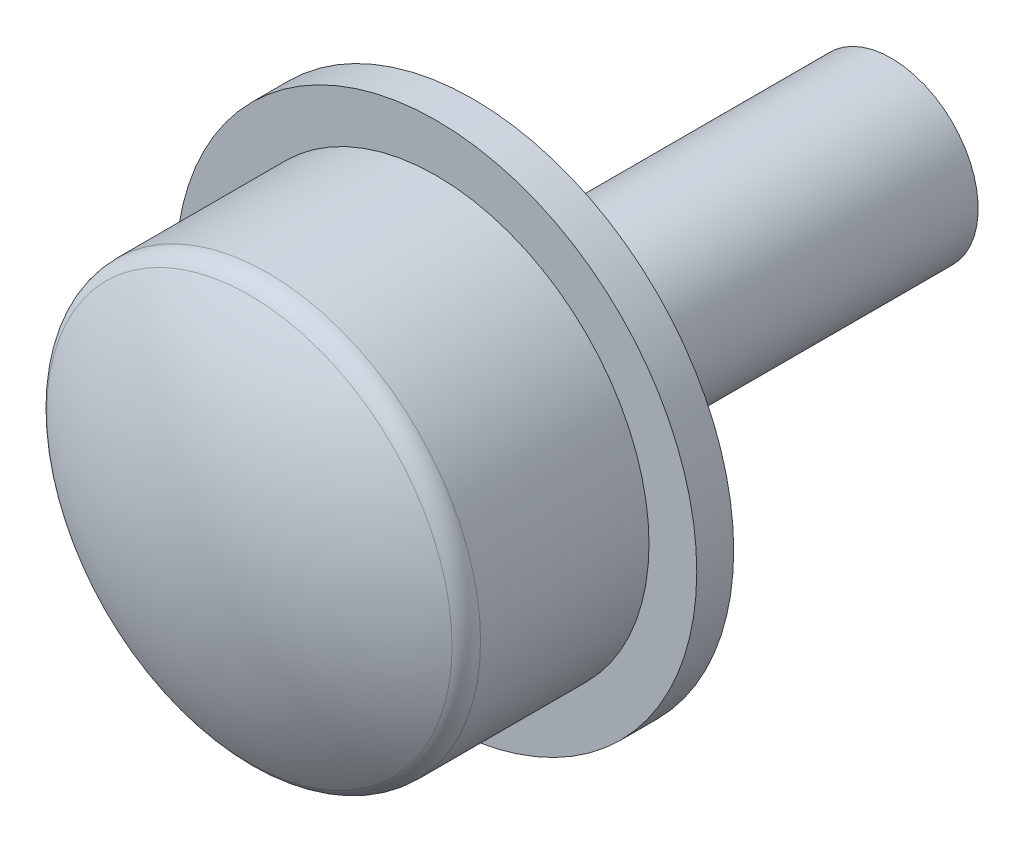
ISO-10303-21;
HEADER;
FILE_DESCRIPTION(('STEP AP214'),'2;1');
FILE_NAME('part.step','',(''),(''),'','','');
FILE_SCHEMA(('AUTOMOTIVE_DESIGN { 1 0 10303 214 1 1 1 1 }'));
ENDSEC;
DATA;
#1=APPLICATION_CONTEXT('core data for automotive mechanical design processes');
#2=APPLICATION_PROTOCOL_DEFINITION('international standard','automotive_design',2000,#1);
#3=PRODUCT_CONTEXT('',#1,'mechanical');
#4=PRODUCT('Part','Part','',(#3));
#5=PRODUCT_RELATED_PRODUCT_CATEGORY('part','',(#4));
#6=PRODUCT_DEFINITION_FORMATION('','',#4);
#7=PRODUCT_DEFINITION_CONTEXT('part definition',#1,'design');
#8=PRODUCT_DEFINITION('design','',#6,#7);
#9=PRODUCT_DEFINITION_SHAPE('','',#8);
#10=(LENGTH_UNIT() NAMED_UNIT(*) SI_UNIT(.MILLI.,.METRE.));
#11=(NAMED_UNIT(*) PLANE_ANGLE_UNIT() SI_UNIT($,.RADIAN.));
#12=(NAMED_UNIT(*) SI_UNIT($,.STERADIAN.) SOLID_ANGLE_UNIT());
#13=UNCERTAINTY_MEASURE_WITH_UNIT(LENGTH_MEASURE(1.E-05),#10,'distance_accuracy_value','');
#14=(GEOMETRIC_REPRESENTATION_CONTEXT(3) GLOBAL_UNCERTAINTY_ASSIGNED_CONTEXT((#13)) GLOBAL_UNIT_ASSIGNED_CONTEXT((#10,
#11,#12)) REPRESENTATION_CONTEXT('',''));
#15=CARTESIAN_POINT('',(0.,0.,0.));
#16=DIRECTION('',(0.,0.,1.));
#17=DIRECTION('',(1.,0.,0.));
#18=AXIS2_PLACEMENT_3D('',#15,#16,#17);
#19=CARTESIAN_POINT('',(0.,0.,5.));
#20=DIRECTION('',(0.,0.,-1.));
#21=DIRECTION('',(-1.,0.,0.));
#22=AXIS2_PLACEMENT_3D('',#19,#20,#21);
#23=CYLINDRICAL_SURFACE('',#22,4.15);
#24=DIRECTION('',(0.,0.,-1.));
#25=VECTOR('',#24,1.);
#26=CARTESIAN_POINT('',(4.02771647462927,1.,6.50200231381359));
#27=LINE('',#26,#25);
#28=CARTESIAN_POINT('',(4.02771647462927,1.,5.));
#29=VERTEX_POINT('',#28);
#30=CARTESIAN_POINT('',(4.02771647462927,1.,0.));
#31=VERTEX_POINT('',#30);
#32=EDGE_CURVE('E203',#29,#31,#27,.T.);
#33=ORIENTED_EDGE('',*,*,#32,.F.);
#34=CARTESIAN_POINT('',(0.,0.,5.));
#35=DIRECTION('',(0.,0.,1.));
#36=DIRECTION('',(1.,0.,0.));
#37=AXIS2_PLACEMENT_3D('',#34,#35,#36);
#38=CIRCLE('',#37,4.15);
#39=CARTESIAN_POINT('',(1.,4.02771647462927,5.));
#40=VERTEX_POINT('',#39);
#41=EDGE_CURVE('E395',#29,#40,#38,.T.);
#42=ORIENTED_EDGE('',*,*,#41,.T.);
#43=DIRECTION('',(0.,0.,-1.));
#44=VECTOR('',#43,1.);
#45=CARTESIAN_POINT('',(1.,4.02771647462927,6.50200231381359));
#46=LINE('',#45,#44);
#47=CARTESIAN_POINT('',(1.,4.02771647462927,0.));
#48=VERTEX_POINT('',#47);
#49=EDGE_CURVE('E232',#40,#48,#46,.T.);
#50=ORIENTED_EDGE('',*,*,#49,.T.);
#51=CARTESIAN_POINT('',(0.,0.,0.));
#52=DIRECTION('',(0.,0.,1.));
#53=DIRECTION('',(1.,0.,0.));
#54=AXIS2_PLACEMENT_3D('',#51,#52,#53);
#55=CIRCLE('',#54,4.15);
#56=EDGE_CURVE('E394',#31,#48,#55,.T.);
#57=ORIENTED_EDGE('',*,*,#56,.F.);
#58=EDGE_LOOP('',(#33,#42,#50,#57));
#59=FACE_BOUND('',#58,.T.);
#60=ADVANCED_FACE('F35',(#59),#23,.F.);
#61=DIRECTION('',(0.,0.,-1.));
#62=VECTOR('',#61,1.);
#63=CARTESIAN_POINT('',(-1.,4.02771647462927,6.50200231381359));
#64=LINE('',#63,#62);
#65=CARTESIAN_POINT('',(-1.,4.02771647462927,5.));
#66=VERTEX_POINT('',#65);
#67=CARTESIAN_POINT('',(-1.,4.02771647462927,0.));
#68=VERTEX_POINT('',#67);
#69=EDGE_CURVE('E229',#66,#68,#64,.T.);
#70=ORIENTED_EDGE('',*,*,#69,.F.);
#71=CARTESIAN_POINT('',(-4.02771647462927,1.,5.));
#72=VERTEX_POINT('',#71);
#73=EDGE_CURVE('E384',#66,#72,#38,.T.);
#74=ORIENTED_EDGE('',*,*,#73,.T.);
#75=DIRECTION('',(0.,0.,-1.));
#76=VECTOR('',#75,1.);
#77=CARTESIAN_POINT('',(-4.02771647462927,1.,6.50200231381359));
#78=LINE('',#77,#76);
#79=CARTESIAN_POINT('',(-4.02771647462927,1.,0.));
#80=VERTEX_POINT('',#79);
#81=EDGE_CURVE('E174',#72,#80,#78,.T.);
#82=ORIENTED_EDGE('',*,*,#81,.T.);
#83=EDGE_CURVE('E161',#68,#80,#55,.T.);
#84=ORIENTED_EDGE('',*,*,#83,.F.);
#85=EDGE_LOOP('',(#70,#74,#82,#84));
#86=FACE_BOUND('',#85,.T.);
#87=ADVANCED_FACE('F344',(#86),#23,.F.);
#88=DIRECTION('',(0.,0.,-1.));
#89=VECTOR('',#88,1.);
#90=CARTESIAN_POINT('',(-4.02771647462927,-1.,6.50200231381359));
#91=LINE('',#90,#89);
#92=CARTESIAN_POINT('',(-4.02771647462927,-1.,5.));
#93=VERTEX_POINT('',#92);
#94=CARTESIAN_POINT('',(-4.02771647462927,-1.,0.));
#95=VERTEX_POINT('',#94);
#96=EDGE_CURVE('E223',#93,#95,#91,.T.);
#97=ORIENTED_EDGE('',*,*,#96,.F.);
#98=CARTESIAN_POINT('',(-1.,-4.02771647462927,5.));
#99=VERTEX_POINT('',#98);
#100=EDGE_CURVE('E377',#93,#99,#38,.T.);
#101=ORIENTED_EDGE('',*,*,#100,.T.);
#102=DIRECTION('',(0.,0.,-1.));
#103=VECTOR('',#102,1.);
#104=CARTESIAN_POINT('',(-1.,-4.02771647462927,6.50200231381359));
#105=LINE('',#104,#103);
#106=CARTESIAN_POINT('',(-1.,-4.02771647462927,0.));
#107=VERTEX_POINT('',#106);
#108=EDGE_CURVE('E218',#99,#107,#105,.T.);
#109=ORIENTED_EDGE('',*,*,#108,.T.);
#110=EDGE_CURVE('E380',#95,#107,#55,.T.);
#111=ORIENTED_EDGE('',*,*,#110,.F.);
#112=EDGE_LOOP('',(#97,#101,#109,#111));
#113=FACE_BOUND('',#112,.T.);
#114=ADVANCED_FACE('F352',(#113),#23,.F.);
#115=CARTESIAN_POINT('',(0.,0.,-3.21655236778393));
#116=DIRECTION('',(0.,0.,1.));
#117=DIRECTION('',(1.,0.,0.));
#118=AXIS2_PLACEMENT_3D('',#115,#116,#117);
#119=DEGENERATE_TOROIDAL_SURFACE('',#118,0.0253740645262453,9.21658729635075,.F.);
#120=CARTESIAN_POINT('',(6.53192942485932,1.,3.18214986142363));
#121=CARTESIAN_POINT('',(6.35206909688982,1.,3.36649956792769));
#122=CARTESIAN_POINT('',(6.16439973885727,1.,3.54322318707306));
#123=CARTESIAN_POINT('',(5.77486056698641,1.,3.88024953473658));
#124=CARTESIAN_POINT('',(5.57299106941987,1.,4.04055262878468));
#125=CARTESIAN_POINT('',(5.1564498999669,1.,4.3435856623148));
#126=CARTESIAN_POINT('',(4.94177754095202,1.,4.48631465733434));
#127=CARTESIAN_POINT('',(4.50118006526702,1.,4.75317503449112));
#128=CARTESIAN_POINT('',(4.27525535908262,1.,4.87730709438356));
#129=CARTESIAN_POINT('',(3.81365350792917,1.,5.1061403855081));
#130=CARTESIAN_POINT('',(3.57797236559759,1.,5.21083355401045));
#131=CARTESIAN_POINT('',(3.09852107819419,1.,5.40001651648054));
#132=CARTESIAN_POINT('',(2.85474750406803,1.,5.48449761815065));
#133=CARTESIAN_POINT('',(2.36131074648482,1.,5.63247153418416));
#134=CARTESIAN_POINT('',(2.1116571668672,1.,5.69599633185864));
#135=CARTESIAN_POINT('',(1.60787948458233,1.,5.80175958941425));
#136=CARTESIAN_POINT('',(1.35375487043481,1.,5.84399559728385));
#137=CARTESIAN_POINT('',(0.788100464502108,1.,5.9134855110936));
#138=CARTESIAN_POINT('',(0.475912414796059,1.,5.9356063771239));
#139=CARTESIAN_POINT('',(0.00746429644385302,1.,5.94417836303991));
#140=CARTESIAN_POINT('',(-0.148665256544842,1.,5.94293825300488));
#141=CARTESIAN_POINT('',(-0.46069089883751,1.,5.93231111796492));
#142=CARTESIAN_POINT('',(-0.616586910585928,1.,5.92292181331315));
#143=CARTESIAN_POINT('',(-0.772162142661165,1.,5.90948110171508));
#144=B_SPLINE_CURVE_WITH_KNOTS('',3,(#120,#121,#122,#123,#124,#125,#126,#127,#128,#129,#130,
#131,#132,#133,#134,#135,#136,#137,#138,#139,#140,#141,#142,#143),.UNSPECIFIED.,.F.,.F.,(4,2,2,
2,2,2,2,2,2,2,2,4),(0.,0.772429127626245,1.5448410568151,2.31729447865604,3.08971974199993,
3.86246467436917,4.63554133449136,5.40743261431704,6.17941277914229,7.11642454678658,
7.58464580752683,8.05299809020406),.UNSPECIFIED.);
#145=CARTESIAN_POINT('',(1.73205080756888,1.,5.77474015832146));
#146=VERTEX_POINT('',#145);
#147=EDGE_CURVE('E241',#29,#146,#144,.T.);
#148=ORIENTED_EDGE('',*,*,#147,.T.);
#149=CARTESIAN_POINT('',(0.,0.,5.77474015832146));
#150=DIRECTION('',(0.,0.,-1.));
#151=DIRECTION('',(-1.,0.,0.));
#152=AXIS2_PLACEMENT_3D('',#149,#150,#151);
#153=CIRCLE('',#152,2.);
#154=CARTESIAN_POINT('',(1.,1.73205080756888,5.77474015832146));
#155=VERTEX_POINT('',#154);
#156=EDGE_CURVE('E250',#146,#155,#153,.F.);
#157=ORIENTED_EDGE('',*,*,#156,.T.);
#158=CARTESIAN_POINT('',(1.,-0.772162142661165,5.90948110171508));
#159=CARTESIAN_POINT('',(1.,-0.66642808665959,5.91860700766712));
#160=CARTESIAN_POINT('',(1.,-0.560532462606554,5.92587235308661));
#161=CARTESIAN_POINT('',(1.,-0.348569071241919,5.93664821484036));
#162=CARTESIAN_POINT('',(1.,-0.242501337286459,5.94015938783224));
#163=CARTESIAN_POINT('',(1.,0.0759440215439665,5.94501728638047));
#164=CARTESIAN_POINT('',(1.,0.288409173270856,5.94067498008673));
#165=CARTESIAN_POINT('',(1.,0.928333905571847,5.90486499386678));
#166=CARTESIAN_POINT('',(1.,1.35479725140542,5.85031084196622));
#167=CARTESIAN_POINT('',(1.,1.9854613887249,5.72415462738974));
#168=CARTESIAN_POINT('',(1.,2.1944093255515,5.67463368904586));
#169=CARTESIAN_POINT('',(1.,2.60829800539381,5.56102832090942));
#170=CARTESIAN_POINT('',(1.,2.81323983582733,5.49694790447495));
#171=CARTESIAN_POINT('',(1.,3.25755474000364,5.34066862731467));
#172=CARTESIAN_POINT('',(1.,3.49586003877173,5.24542409160749));
#173=CARTESIAN_POINT('',(1.,3.96358066825006,5.03530522174408));
#174=CARTESIAN_POINT('',(1.,4.19299807275107,4.92043550093886));
#175=CARTESIAN_POINT('',(1.,4.64122242040377,4.67195717746327));
#176=CARTESIAN_POINT('',(1.,4.86003715547419,4.53836262564036));
#177=CARTESIAN_POINT('',(1.,5.28561449083834,4.25336564489637));
#178=CARTESIAN_POINT('',(1.,5.49238277220873,4.10197171346415));
#179=CARTESIAN_POINT('',(1.,5.84014435631191,3.82422971079596));
#180=CARTESIAN_POINT('',(1.,5.98419611115803,3.70168790239723));
#181=CARTESIAN_POINT('',(1.,6.26418814179404,3.44816743245459));
#182=CARTESIAN_POINT('',(1.,6.40014293939572,3.31720480856869));
#183=CARTESIAN_POINT('',(1.,6.53192942485932,3.18214986142363));
#184=B_SPLINE_CURVE_WITH_KNOTS('',3,(#158,#159,#160,#161,#162,#163,#164,#165,#166,#167,#168,
#169,#170,#171,#172,#173,#174,#175,#176,#177,#178,#179,#180,#181,#182,#183),.UNSPECIFIED.,.F.,
.F.,(4,2,2,2,2,2,2,2,2,2,2,2,4),(0.,0.318366500520787,0.636677305142935,1.27376334427966,
2.55845828462446,3.20226695640181,3.8458983754865,4.61488148711788,5.38368407968487,
6.15191283187279,6.9197763068146,7.48679955136423,8.05277315999369),.UNSPECIFIED.);
#185=EDGE_CURVE('E264',#155,#40,#184,.T.);
#186=ORIENTED_EDGE('',*,*,#185,.T.);
#187=ORIENTED_EDGE('',*,*,#41,.F.);
#188=EDGE_LOOP('',(#148,#157,#186,#187));
#189=FACE_BOUND('',#188,.T.);
#190=ADVANCED_FACE('F363',(#189),#119,.T.);
#191=CARTESIAN_POINT('',(-1.,6.53192942485932,3.18214986142362));
#192=CARTESIAN_POINT('',(-1.,6.35206909688982,3.36649956792769));
#193=CARTESIAN_POINT('',(-1.,6.16439973885727,3.54322318707306));
#194=CARTESIAN_POINT('',(-1.,5.77486056698641,3.88024953473658));
#195=CARTESIAN_POINT('',(-1.,5.57299106941987,4.04055262878468));
#196=CARTESIAN_POINT('',(-1.,5.1564498999669,4.3435856623148));
#197=CARTESIAN_POINT('',(-1.,4.94177754095202,4.48631465733434));
#198=CARTESIAN_POINT('',(-1.,4.50118006526702,4.75317503449111));
#199=CARTESIAN_POINT('',(-1.,4.27525535908262,4.87730709438356));
#200=CARTESIAN_POINT('',(-1.,3.81365350792917,5.1061403855081));
#201=CARTESIAN_POINT('',(-1.,3.57797236559759,5.21083355401045));
#202=CARTESIAN_POINT('',(-1.,3.09852107819419,5.40001651648054));
#203=CARTESIAN_POINT('',(-1.,2.85474750406804,5.48449761815065));
#204=CARTESIAN_POINT('',(-1.,2.36131074648482,5.63247153418416));
#205=CARTESIAN_POINT('',(-1.,2.11165716686721,5.69599633185864));
#206=CARTESIAN_POINT('',(-1.,1.60787948458234,5.80175958941425));
#207=CARTESIAN_POINT('',(-1.,1.35375487043482,5.84399559728385));
#208=CARTESIAN_POINT('',(-1.,0.788100464502113,5.9134855110936));
#209=CARTESIAN_POINT('',(-1.,0.475912414796063,5.9356063771239));
#210=CARTESIAN_POINT('',(-1.,0.00746429644385486,5.94417836303991));
#211=CARTESIAN_POINT('',(-1.,-0.148665256544841,5.94293825300488));
#212=CARTESIAN_POINT('',(-1.,-0.46069089883751,5.93231111796492));
#213=CARTESIAN_POINT('',(-1.,-0.616586910585929,5.92292181331315));
#214=CARTESIAN_POINT('',(-1.,-0.772162142661166,5.90948110171508));
#215=B_SPLINE_CURVE_WITH_KNOTS('',3,(#191,#192,#193,#194,#195,#196,#197,#198,#199,#200,#201,
#202,#203,#204,#205,#206,#207,#208,#209,#210,#211,#212,#213,#214),.UNSPECIFIED.,.F.,.F.,(4,2,2,
2,2,2,2,2,2,2,2,4),(0.,0.772429127626246,1.5448410568151,2.31729447865604,3.08971974199993,
3.86246467436917,4.63554133449136,5.40743261431704,6.17941277914229,7.11642454678658,
7.58464580752683,8.05299809020407),.UNSPECIFIED.);
#216=CARTESIAN_POINT('',(-1.,1.73205080756888,5.77474015832146));
#217=VERTEX_POINT('',#216);
#218=EDGE_CURVE('E272',#66,#217,#215,.T.);
#219=ORIENTED_EDGE('',*,*,#218,.T.);
#220=CARTESIAN_POINT('',(0.,0.,5.77474015832146));
#221=DIRECTION('',(0.,0.,-1.));
#222=DIRECTION('',(-1.,0.,0.));
#223=AXIS2_PLACEMENT_3D('',#220,#221,#222);
#224=CIRCLE('',#223,2.);
#225=CARTESIAN_POINT('',(-1.73205080756888,1.,5.77474015832146));
#226=VERTEX_POINT('',#225);
#227=EDGE_CURVE('E387',#217,#226,#224,.F.);
#228=ORIENTED_EDGE('',*,*,#227,.T.);
#229=CARTESIAN_POINT('',(0.772162142661165,1.,5.90948110171508));
#230=CARTESIAN_POINT('',(0.66642808665959,1.,5.91860700766712));
#231=CARTESIAN_POINT('',(0.560532462606554,1.,5.92587235308661));
#232=CARTESIAN_POINT('',(0.348569071241919,1.,5.93664821484036));
#233=CARTESIAN_POINT('',(0.242501337286459,1.,5.94015938783224));
#234=CARTESIAN_POINT('',(-0.0759440215439665,1.,5.94501728638047));
#235=CARTESIAN_POINT('',(-0.288409173270856,1.,5.94067498008673));
#236=CARTESIAN_POINT('',(-0.928333905571847,1.,5.90486499386678));
#237=CARTESIAN_POINT('',(-1.35479725140542,1.,5.85031084196622));
#238=CARTESIAN_POINT('',(-1.9854613887249,1.,5.72415462738974));
#239=CARTESIAN_POINT('',(-2.1944093255515,1.,5.67463368904586));
#240=CARTESIAN_POINT('',(-2.60829800539381,1.,5.56102832090942));
#241=CARTESIAN_POINT('',(-2.81323983582733,1.,5.49694790447495));
#242=CARTESIAN_POINT('',(-3.25755474000364,1.,5.34066862731467));
#243=CARTESIAN_POINT('',(-3.49586003877173,1.,5.24542409160749));
#244=CARTESIAN_POINT('',(-3.96358066825006,1.,5.03530522174408));
#245=CARTESIAN_POINT('',(-4.19299807275107,1.,4.92043550093886));
#246=CARTESIAN_POINT('',(-4.64122242040377,1.,4.67195717746327));
#247=CARTESIAN_POINT('',(-4.86003715547419,1.,4.53836262564036));
#248=CARTESIAN_POINT('',(-5.28561449083834,1.,4.25336564489637));
#249=CARTESIAN_POINT('',(-5.49238277220873,1.,4.10197171346415));
#250=CARTESIAN_POINT('',(-5.84014435631191,1.,3.82422971079596));
#251=CARTESIAN_POINT('',(-5.98419611115803,1.,3.70168790239723));
#252=CARTESIAN_POINT('',(-6.26418814179404,1.,3.44816743245459));
#253=CARTESIAN_POINT('',(-6.40014293939572,1.,3.31720480856869));
#254=CARTESIAN_POINT('',(-6.53192942485932,1.,3.18214986142363));
#255=B_SPLINE_CURVE_WITH_KNOTS('',3,(#229,#230,#231,#232,#233,#234,#235,#236,#237,#238,#239,
#240,#241,#242,#243,#244,#245,#246,#247,#248,#249,#250,#251,#252,#253,#254),.UNSPECIFIED.,.F.,
.F.,(4,2,2,2,2,2,2,2,2,2,2,2,4),(0.,0.318366500520787,0.636677305142935,1.27376334427966,
2.55845828462446,3.20226695640181,3.8458983754865,4.61488148711788,5.38368407968487,
6.15191283187279,6.9197763068146,7.48679955136423,8.05277315999369),.UNSPECIFIED.);
#256=EDGE_CURVE('E171',#226,#72,#255,.T.);
#257=ORIENTED_EDGE('',*,*,#256,.T.);
#258=ORIENTED_EDGE('',*,*,#73,.F.);
#259=EDGE_LOOP('',(#219,#228,#257,#258));
#260=FACE_BOUND('',#259,.T.);
#261=ADVANCED_FACE('F373',(#260),#119,.T.);
#262=CARTESIAN_POINT('',(-6.53192942485932,-1.,3.18214986142363));
#263=CARTESIAN_POINT('',(-6.35206909688982,-1.,3.36649956792769));
#264=CARTESIAN_POINT('',(-6.16439973885727,-1.,3.54322318707306));
#265=CARTESIAN_POINT('',(-5.77486056698641,-1.,3.88024953473658));
#266=CARTESIAN_POINT('',(-5.57299106941987,-1.,4.04055262878468));
#267=CARTESIAN_POINT('',(-5.1564498999669,-1.,4.3435856623148));
#268=CARTESIAN_POINT('',(-4.94177754095202,-1.,4.48631465733434));
#269=CARTESIAN_POINT('',(-4.50118006526702,-1.,4.75317503449112));
#270=CARTESIAN_POINT('',(-4.27525535908262,-1.,4.87730709438356));
#271=CARTESIAN_POINT('',(-3.81365350792917,-1.,5.10614038550811));
#272=CARTESIAN_POINT('',(-3.57797236559759,-1.,5.21083355401045));
#273=CARTESIAN_POINT('',(-3.09852107819419,-1.,5.40001651648054));
#274=CARTESIAN_POINT('',(-2.85474750406803,-1.,5.48449761815065));
#275=CARTESIAN_POINT('',(-2.36131074648482,-1.,5.63247153418416));
#276=CARTESIAN_POINT('',(-2.1116571668672,-1.,5.69599633185864));
#277=CARTESIAN_POINT('',(-1.60787948458234,-1.,5.80175958941425));
#278=CARTESIAN_POINT('',(-1.35375487043482,-1.,5.84399559728385));
#279=CARTESIAN_POINT('',(-0.788100464502109,-1.,5.9134855110936));
#280=CARTESIAN_POINT('',(-0.475912414796059,-1.,5.9356063771239));
#281=CARTESIAN_POINT('',(-0.00746429644385348,-1.,5.94417836303991));
#282=CARTESIAN_POINT('',(0.148665256544841,-1.,5.94293825300488));
#283=CARTESIAN_POINT('',(0.460690898837509,-1.,5.93231111796492));
#284=CARTESIAN_POINT('',(0.616586910585928,-1.,5.92292181331315));
#285=CARTESIAN_POINT('',(0.772162142661165,-1.,5.90948110171508));
#286=B_SPLINE_CURVE_WITH_KNOTS('',3,(#262,#263,#264,#265,#266,#267,#268,#269,#270,#271,#272,
#273,#274,#275,#276,#277,#278,#279,#280,#281,#282,#283,#284,#285),.UNSPECIFIED.,.F.,.F.,(4,2,2,
2,2,2,2,2,2,2,2,4),(0.,0.772429127626245,1.5448410568151,2.31729447865604,3.08971974199993,
3.86246467436917,4.63554133449136,5.40743261431704,6.17941277914229,7.11642454678658,
7.58464580752683,8.05299809020406),.UNSPECIFIED.);
#287=CARTESIAN_POINT('',(-1.73205080756888,-1.,5.77474015832146));
#288=VERTEX_POINT('',#287);
#289=EDGE_CURVE('E288',#93,#288,#286,.T.);
#290=ORIENTED_EDGE('',*,*,#289,.T.);
#291=CARTESIAN_POINT('',(0.,0.,5.77474015832146));
#292=DIRECTION('',(0.,0.,-1.));
#293=DIRECTION('',(-1.,0.,0.));
#294=AXIS2_PLACEMENT_3D('',#291,#292,#293);
#295=CIRCLE('',#294,2.);
#296=CARTESIAN_POINT('',(-1.,-1.73205080756888,5.77474015832146));
#297=VERTEX_POINT('',#296);
#298=EDGE_CURVE('E386',#288,#297,#295,.F.);
#299=ORIENTED_EDGE('',*,*,#298,.T.);
#300=CARTESIAN_POINT('',(-1.,0.772162142661166,5.90948110171508));
#301=CARTESIAN_POINT('',(-1.,0.666428086659591,5.91860700766712));
#302=CARTESIAN_POINT('',(-1.,0.560532462606555,5.92587235308661));
#303=CARTESIAN_POINT('',(-1.,0.34856907124192,5.93664821484036));
#304=CARTESIAN_POINT('',(-1.,0.24250133728646,5.94015938783224));
#305=CARTESIAN_POINT('',(-1.,-0.0759440215439656,5.94501728638047));
#306=CARTESIAN_POINT('',(-1.,-0.288409173270854,5.94067498008673));
#307=CARTESIAN_POINT('',(-1.,-0.928333905571844,5.90486499386678));
#308=CARTESIAN_POINT('',(-1.,-1.35479725140542,5.85031084196622));
#309=CARTESIAN_POINT('',(-1.,-1.9854613887249,5.72415462738974));
#310=CARTESIAN_POINT('',(-1.,-2.1944093255515,5.67463368904586));
#311=CARTESIAN_POINT('',(-1.,-2.6082980053938,5.56102832090942));
#312=CARTESIAN_POINT('',(-1.,-2.81323983582733,5.49694790447495));
#313=CARTESIAN_POINT('',(-1.,-3.25755474000364,5.34066862731467));
#314=CARTESIAN_POINT('',(-1.,-3.49586003877172,5.24542409160749));
#315=CARTESIAN_POINT('',(-1.,-3.96358066825006,5.03530522174408));
#316=CARTESIAN_POINT('',(-1.,-4.19299807275107,4.92043550093886));
#317=CARTESIAN_POINT('',(-1.,-4.64122242040377,4.67195717746327));
#318=CARTESIAN_POINT('',(-1.,-4.86003715547419,4.53836262564037));
#319=CARTESIAN_POINT('',(-1.,-5.28561449083834,4.25336564489637));
#320=CARTESIAN_POINT('',(-1.,-5.49238277220872,4.10197171346415));
#321=CARTESIAN_POINT('',(-1.,-5.84014435631191,3.82422971079596));
#322=CARTESIAN_POINT('',(-1.,-5.98419611115803,3.70168790239723));
#323=CARTESIAN_POINT('',(-1.,-6.26418814179404,3.44816743245459));
#324=CARTESIAN_POINT('',(-1.,-6.40014293939572,3.31720480856869));
#325=CARTESIAN_POINT('',(-1.,-6.53192942485933,3.18214986142363));
#326=B_SPLINE_CURVE_WITH_KNOTS('',3,(#300,#301,#302,#303,#304,#305,#306,#307,#308,#309,#310,
#311,#312,#313,#314,#315,#316,#317,#318,#319,#320,#321,#322,#323,#324,#325),.UNSPECIFIED.,.F.,
.F.,(4,2,2,2,2,2,2,2,2,2,2,2,4),(0.,0.318366500520788,0.636677305142936,1.27376334427966,
2.55845828462446,3.2022669564018,3.8458983754865,4.61488148711788,5.38368407968487,
6.15191283187279,6.91977630681459,7.48679955136423,8.05277315999369),.UNSPECIFIED.);
#327=EDGE_CURVE('E296',#297,#99,#326,.T.);
#328=ORIENTED_EDGE('',*,*,#327,.T.);
#329=ORIENTED_EDGE('',*,*,#100,.F.);
#330=EDGE_LOOP('',(#290,#299,#328,#329));
#331=FACE_BOUND('',#330,.T.);
#332=ADVANCED_FACE('F364',(#331),#119,.T.);
#333=CARTESIAN_POINT('',(0.,0.,4.72955185991567));
#334=DIRECTION('',(0.,0.,-1.));
#335=DIRECTION('',(-1.,0.,0.));
#336=AXIS2_PLACEMENT_3D('',#333,#334,#335);
#337=TOROIDAL_SURFACE('',#336,4.4,0.5);
#338=CARTESIAN_POINT('',(0.,0.,5.15239184037038));
#339=DIRECTION('',(0.,0.,-1.));
#340=DIRECTION('',(-1.,0.,0.));
#341=AXIS2_PLACEMENT_3D('',#338,#339,#340);
#342=CIRCLE('',#341,4.66684518157363);
#343=CARTESIAN_POINT('',(-4.66684518157363,0.,5.15239184037038));
#344=VERTEX_POINT('',#343);
#345=EDGE_CURVE('E187',#344,#344,#342,.F.);
#346=ORIENTED_EDGE('',*,*,#345,.F.);
#347=EDGE_LOOP('',(#346));
#348=FACE_BOUND('',#347,.T.);
#349=CARTESIAN_POINT('',(0.,0.,4.72955185991567));
#350=DIRECTION('',(0.,0.,-1.));
#351=DIRECTION('',(-1.,0.,0.));
#352=AXIS2_PLACEMENT_3D('',#349,#350,#351);
#353=CIRCLE('',#352,4.9);
#354=CARTESIAN_POINT('',(-4.9,0.,4.72955185991567));
#355=VERTEX_POINT('',#354);
#356=EDGE_CURVE('E39',#355,#355,#353,.T.);
#357=ORIENTED_EDGE('',*,*,#356,.F.);
#358=EDGE_LOOP('',(#357));
#359=FACE_BOUND('',#358,.T.);
#360=ADVANCED_FACE('F37',(#348,#359),#337,.T.);
#361=CARTESIAN_POINT('',(0.,0.,0.85));
#362=DIRECTION('',(0.,0.,1.));
#363=DIRECTION('',(1.,0.,0.));
#364=AXIS2_PLACEMENT_3D('',#361,#362,#363);
#365=PLANE('',#364);
#366=CARTESIAN_POINT('',(0.,0.,0.85));
#367=DIRECTION('',(0.,0.,1.));
#368=DIRECTION('',(1.,0.,0.));
#369=AXIS2_PLACEMENT_3D('',#366,#367,#368);
#370=CIRCLE('',#369,6.);
#371=CARTESIAN_POINT('',(6.,0.,0.85));
#372=VERTEX_POINT('',#371);
#373=EDGE_CURVE('E402',#372,#372,#370,.T.);
#374=ORIENTED_EDGE('',*,*,#373,.T.);
#375=EDGE_LOOP('',(#374));
#376=FACE_BOUND('',#375,.T.);
#377=CARTESIAN_POINT('',(0.,0.,0.85));
#378=DIRECTION('',(0.,0.,1.));
#379=DIRECTION('',(1.,0.,0.));
#380=AXIS2_PLACEMENT_3D('',#377,#378,#379);
#381=CIRCLE('',#380,4.9);
#382=CARTESIAN_POINT('',(4.9,0.,0.85));
#383=VERTEX_POINT('',#382);
#384=EDGE_CURVE('E398',#383,#383,#381,.T.);
#385=ORIENTED_EDGE('',*,*,#384,.F.);
#386=EDGE_LOOP('',(#385));
#387=FACE_BOUND('',#386,.T.);
#388=ADVANCED_FACE('F413',(#376,#387),#365,.T.);
#389=CARTESIAN_POINT('',(0.,0.,0.));
#390=DIRECTION('',(0.,0.,1.));
#391=DIRECTION('',(1.,0.,0.));
#392=AXIS2_PLACEMENT_3D('',#389,#390,#391);
#393=PLANE('',#392);
#394=CARTESIAN_POINT('',(0.,0.,0.));
#395=DIRECTION('',(0.,0.,-1.));
#396=DIRECTION('',(-1.,0.,0.));
#397=AXIS2_PLACEMENT_3D('',#394,#395,#396);
#398=CIRCLE('',#397,2.);
#399=CARTESIAN_POINT('',(-1.,1.73205080756888,0.));
#400=VERTEX_POINT('',#399);
#401=CARTESIAN_POINT('',(1.,1.73205080756888,0.));
#402=VERTEX_POINT('',#401);
#403=EDGE_CURVE('E11',#400,#402,#398,.T.);
#404=ORIENTED_EDGE('',*,*,#403,.F.);
#405=DIRECTION('',(0.,1.,0.));
#406=VECTOR('',#405,1.);
#407=CARTESIAN_POINT('',(-1.,4.02771647462927,0.));
#408=LINE('',#407,#406);
#409=EDGE_CURVE('E165',#400,#68,#408,.T.);
#410=ORIENTED_EDGE('',*,*,#409,.T.);
#411=ORIENTED_EDGE('',*,*,#83,.T.);
#412=DIRECTION('',(1.,0.,0.));
#413=VECTOR('',#412,1.);
#414=CARTESIAN_POINT('',(-1.73205080756888,1.,0.));
#415=LINE('',#414,#413);
#416=CARTESIAN_POINT('',(-1.73205080756888,1.,0.));
#417=VERTEX_POINT('',#416);
#418=EDGE_CURVE('E153',#80,#417,#415,.T.);
#419=ORIENTED_EDGE('',*,*,#418,.T.);
#420=CARTESIAN_POINT('',(-1.73205080756888,-1.,0.));
#421=VERTEX_POINT('',#420);
#422=EDGE_CURVE('E46',#421,#417,#398,.T.);
#423=ORIENTED_EDGE('',*,*,#422,.F.);
#424=DIRECTION('',(-1.,0.,0.));
#425=VECTOR('',#424,1.);
#426=CARTESIAN_POINT('',(-1.73205080756888,-1.,0.));
#427=LINE('',#426,#425);
#428=EDGE_CURVE('E164',#421,#95,#427,.T.);
#429=ORIENTED_EDGE('',*,*,#428,.T.);
#430=ORIENTED_EDGE('',*,*,#110,.T.);
#431=DIRECTION('',(0.,1.,0.));
#432=VECTOR('',#431,1.);
#433=CARTESIAN_POINT('',(-1.,-1.73205080756888,0.));
#434=LINE('',#433,#432);
#435=CARTESIAN_POINT('',(-1.,-1.73205080756888,0.));
#436=VERTEX_POINT('',#435);
#437=EDGE_CURVE('E196',#107,#436,#434,.T.);
#438=ORIENTED_EDGE('',*,*,#437,.T.);
#439=CARTESIAN_POINT('',(1.,-1.73205080756888,0.));
#440=VERTEX_POINT('',#439);
#441=EDGE_CURVE('E184',#440,#436,#398,.T.);
#442=ORIENTED_EDGE('',*,*,#441,.F.);
#443=DIRECTION('',(0.,-1.,0.));
#444=VECTOR('',#443,1.);
#445=CARTESIAN_POINT('',(1.,-1.73205080756888,0.));
#446=LINE('',#445,#444);
#447=CARTESIAN_POINT('',(1.,-4.02771647462927,0.));
#448=VERTEX_POINT('',#447);
#449=EDGE_CURVE('E197',#440,#448,#446,.T.);
#450=ORIENTED_EDGE('',*,*,#449,.T.);
#451=CARTESIAN_POINT('',(4.02771647462927,-1.,0.));
#452=VERTEX_POINT('',#451);
#453=EDGE_CURVE('E57',#448,#452,#55,.T.);
#454=ORIENTED_EDGE('',*,*,#453,.T.);
#455=DIRECTION('',(-1.,0.,0.));
#456=VECTOR('',#455,1.);
#457=CARTESIAN_POINT('',(4.02771647462927,-1.,0.));
#458=LINE('',#457,#456);
#459=CARTESIAN_POINT('',(1.73205080756888,-0.999999999999999,0.));
#460=VERTEX_POINT('',#459);
#461=EDGE_CURVE('E200',#452,#460,#458,.T.);
#462=ORIENTED_EDGE('',*,*,#461,.T.);
#463=CARTESIAN_POINT('',(1.73205080756888,1.,0.));
#464=VERTEX_POINT('',#463);
#465=EDGE_CURVE('E44',#464,#460,#398,.T.);
#466=ORIENTED_EDGE('',*,*,#465,.F.);
#467=DIRECTION('',(1.,0.,0.));
#468=VECTOR('',#467,1.);
#469=CARTESIAN_POINT('',(4.02771647462927,1.,0.));
#470=LINE('',#469,#468);
#471=EDGE_CURVE('E194',#464,#31,#470,.T.);
#472=ORIENTED_EDGE('',*,*,#471,.T.);
#473=ORIENTED_EDGE('',*,*,#56,.T.);
#474=DIRECTION('',(0.,-1.,0.));
#475=VECTOR('',#474,1.);
#476=CARTESIAN_POINT('',(1.,4.02771647462927,0.));
#477=LINE('',#476,#475);
#478=EDGE_CURVE('E191',#48,#402,#477,.T.);
#479=ORIENTED_EDGE('',*,*,#478,.T.);
#480=EDGE_LOOP('',(#404,#410,#411,#419,#423,#429,#430,#438,#442,#450,#454,#462,#466,#472,#473,#479));
#481=FACE_BOUND('',#480,.T.);
#482=CARTESIAN_POINT('',(0.,0.,0.));
#483=DIRECTION('',(0.,0.,1.));
#484=DIRECTION('',(1.,0.,0.));
#485=AXIS2_PLACEMENT_3D('',#482,#483,#484);
#486=CIRCLE('',#485,6.);
#487=CARTESIAN_POINT('',(6.,0.,0.));
#488=VERTEX_POINT('',#487);
#489=EDGE_CURVE('E401',#488,#488,#486,.T.);
#490=ORIENTED_EDGE('',*,*,#489,.F.);
#491=EDGE_LOOP('',(#490));
#492=FACE_BOUND('',#491,.T.);
#493=ADVANCED_FACE('F155',(#481,#492),#393,.F.);
#494=CARTESIAN_POINT('',(0.,0.,0.85));
#495=DIRECTION('',(0.,0.,-1.));
#496=DIRECTION('',(-1.,0.,0.));
#497=AXIS2_PLACEMENT_3D('',#494,#495,#496);
#498=CYLINDRICAL_SURFACE('',#497,6.);
#499=ORIENTED_EDGE('',*,*,#373,.F.);
#500=EDGE_LOOP('',(#499));
#501=FACE_BOUND('',#500,.T.);
#502=ORIENTED_EDGE('',*,*,#489,.T.);
#503=EDGE_LOOP('',(#502));
#504=FACE_BOUND('',#503,.T.);
#505=ADVANCED_FACE('F366',(#501,#504),#498,.T.);
#506=CARTESIAN_POINT('',(0.,0.,5.));
#507=DIRECTION('',(0.,0.,-1.));
#508=DIRECTION('',(-1.,0.,0.));
#509=AXIS2_PLACEMENT_3D('',#506,#507,#508);
#510=CYLINDRICAL_SURFACE('',#509,4.9);
#511=ORIENTED_EDGE('',*,*,#356,.T.);
#512=EDGE_LOOP('',(#511));
#513=FACE_BOUND('',#512,.T.);
#514=ORIENTED_EDGE('',*,*,#384,.T.);
#515=EDGE_LOOP('',(#514));
#516=FACE_BOUND('',#515,.T.);
#517=ADVANCED_FACE('F357',(#513,#516),#510,.T.);
#518=DIRECTION('',(0.,0.,-1.));
#519=VECTOR('',#518,1.);
#520=CARTESIAN_POINT('',(0.999999999999998,-4.02771647462927,6.50200231381359));
#521=LINE('',#520,#519);
#522=CARTESIAN_POINT('',(0.999999999999998,-4.02771647462927,5.));
#523=VERTEX_POINT('',#522);
#524=EDGE_CURVE('E216',#523,#448,#521,.T.);
#525=ORIENTED_EDGE('',*,*,#524,.F.);
#526=CARTESIAN_POINT('',(4.02771647462927,-1.,5.));
#527=VERTEX_POINT('',#526);
#528=EDGE_CURVE('E249',#523,#527,#38,.T.);
#529=ORIENTED_EDGE('',*,*,#528,.T.);
#530=DIRECTION('',(0.,0.,-1.));
#531=VECTOR('',#530,1.);
#532=CARTESIAN_POINT('',(4.02771647462927,-1.,6.50200231381359));
#533=LINE('',#532,#531);
#534=EDGE_CURVE('E53',#527,#452,#533,.T.);
#535=ORIENTED_EDGE('',*,*,#534,.T.);
#536=ORIENTED_EDGE('',*,*,#453,.F.);
#537=EDGE_LOOP('',(#525,#529,#535,#536));
#538=FACE_BOUND('',#537,.T.);
#539=ADVANCED_FACE('F347',(#538),#23,.F.);
#540=CARTESIAN_POINT('',(1.,-6.53192942485932,3.18214986142362));
#541=CARTESIAN_POINT('',(1.,-6.35206909688982,3.36649956792769));
#542=CARTESIAN_POINT('',(1.,-6.16439973885727,3.54322318707306));
#543=CARTESIAN_POINT('',(1.,-5.77486056698642,3.88024953473658));
#544=CARTESIAN_POINT('',(1.,-5.57299106941987,4.04055262878468));
#545=CARTESIAN_POINT('',(1.,-5.1564498999669,4.3435856623148));
#546=CARTESIAN_POINT('',(1.,-4.94177754095202,4.48631465733434));
#547=CARTESIAN_POINT('',(1.,-4.50118006526702,4.75317503449112));
#548=CARTESIAN_POINT('',(1.,-4.27525535908262,4.87730709438356));
#549=CARTESIAN_POINT('',(1.,-3.81365350792918,5.1061403855081));
#550=CARTESIAN_POINT('',(1.,-3.57797236559759,5.21083355401045));
#551=CARTESIAN_POINT('',(1.,-3.09852107819419,5.40001651648054));
#552=CARTESIAN_POINT('',(1.,-2.85474750406804,5.48449761815065));
#553=CARTESIAN_POINT('',(1.,-2.36131074648482,5.63247153418416));
#554=CARTESIAN_POINT('',(1.,-2.11165716686721,5.69599633185864));
#555=CARTESIAN_POINT('',(1.,-1.60787948458234,5.80175958941425));
#556=CARTESIAN_POINT('',(1.,-1.35375487043482,5.84399559728385));
#557=CARTESIAN_POINT('',(1.,-0.78810046450211,5.9134855110936));
#558=CARTESIAN_POINT('',(1.,-0.475912414796061,5.9356063771239));
#559=CARTESIAN_POINT('',(1.,-0.00746429644385354,5.94417836303991));
#560=CARTESIAN_POINT('',(1.,0.148665256544841,5.94293825300488));
#561=CARTESIAN_POINT('',(1.,0.460690898837509,5.93231111796492));
#562=CARTESIAN_POINT('',(1.,0.616586910585928,5.92292181331316));
#563=CARTESIAN_POINT('',(1.,0.772162142661166,5.90948110171508));
#564=B_SPLINE_CURVE_WITH_KNOTS('',3,(#540,#541,#542,#543,#544,#545,#546,#547,#548,#549,#550,
#551,#552,#553,#554,#555,#556,#557,#558,#559,#560,#561,#562,#563),.UNSPECIFIED.,.F.,.F.,(4,2,2,
2,2,2,2,2,2,2,2,4),(0.,0.772429127626245,1.5448410568151,2.31729447865604,3.08971974199993,
3.86246467436917,4.63554133449136,5.40743261431704,6.17941277914229,7.11642454678659,
7.58464580752683,8.05299809020407),.UNSPECIFIED.);
#565=CARTESIAN_POINT('',(1.,-1.73205080756888,5.77474015832146));
#566=VERTEX_POINT('',#565);
#567=EDGE_CURVE('E303',#523,#566,#564,.T.);
#568=ORIENTED_EDGE('',*,*,#567,.T.);
#569=CARTESIAN_POINT('',(0.,0.,5.77474015832146));
#570=DIRECTION('',(0.,0.,-1.));
#571=DIRECTION('',(-1.,0.,0.));
#572=AXIS2_PLACEMENT_3D('',#569,#570,#571);
#573=CIRCLE('',#572,2.);
#574=CARTESIAN_POINT('',(1.73205080756888,-0.999999999999999,5.77474015832146));
#575=VERTEX_POINT('',#574);
#576=EDGE_CURVE('E310',#566,#575,#573,.F.);
#577=ORIENTED_EDGE('',*,*,#576,.T.);
#578=CARTESIAN_POINT('',(-0.772162142661165,-1.,5.90948110171508));
#579=CARTESIAN_POINT('',(-0.666428086659589,-1.,5.91860700766712));
#580=CARTESIAN_POINT('',(-0.560532462606553,-1.,5.92587235308661));
#581=CARTESIAN_POINT('',(-0.348569071241919,-1.,5.93664821484036));
#582=CARTESIAN_POINT('',(-0.242501337286459,-1.,5.94015938783224));
#583=CARTESIAN_POINT('',(0.0759440215439664,-1.,5.94501728638047));
#584=CARTESIAN_POINT('',(0.288409173270856,-1.,5.94067498008673));
#585=CARTESIAN_POINT('',(0.928333905571846,-1.,5.90486499386679));
#586=CARTESIAN_POINT('',(1.35479725140542,-1.,5.85031084196622));
#587=CARTESIAN_POINT('',(1.9854613887249,-1.,5.72415462738974));
#588=CARTESIAN_POINT('',(2.1944093255515,-1.,5.67463368904586));
#589=CARTESIAN_POINT('',(2.60829800539381,-1.,5.56102832090942));
#590=CARTESIAN_POINT('',(2.81323983582733,-1.,5.49694790447495));
#591=CARTESIAN_POINT('',(3.25755474000364,-1.,5.34066862731467));
#592=CARTESIAN_POINT('',(3.49586003877173,-1.,5.24542409160749));
#593=CARTESIAN_POINT('',(3.96358066825006,-1.,5.03530522174408));
#594=CARTESIAN_POINT('',(4.19299807275107,-1.,4.92043550093886));
#595=CARTESIAN_POINT('',(4.64122242040377,-1.,4.67195717746327));
#596=CARTESIAN_POINT('',(4.86003715547419,-1.,4.53836262564036));
#597=CARTESIAN_POINT('',(5.28561449083834,-1.,4.25336564489637));
#598=CARTESIAN_POINT('',(5.49238277220873,-1.,4.10197171346415));
#599=CARTESIAN_POINT('',(5.84014435631191,-1.,3.82422971079596));
#600=CARTESIAN_POINT('',(5.98419611115802,-1.,3.70168790239723));
#601=CARTESIAN_POINT('',(6.26418814179404,-1.,3.44816743245459));
#602=CARTESIAN_POINT('',(6.40014293939572,-1.,3.31720480856869));
#603=CARTESIAN_POINT('',(6.53192942485932,-1.,3.18214986142363));
#604=B_SPLINE_CURVE_WITH_KNOTS('',3,(#578,#579,#580,#581,#582,#583,#584,#585,#586,#587,#588,
#589,#590,#591,#592,#593,#594,#595,#596,#597,#598,#599,#600,#601,#602,#603),.UNSPECIFIED.,.F.,
.F.,(4,2,2,2,2,2,2,2,2,2,2,2,4),(0.,0.318366500520787,0.636677305142935,1.27376334427966,
2.55845828462446,3.20226695640181,3.8458983754865,4.61488148711788,5.38368407968487,
6.15191283187279,6.9197763068146,7.48679955136423,8.05277315999369),.UNSPECIFIED.);
#605=EDGE_CURVE('E210',#575,#527,#604,.T.);
#606=ORIENTED_EDGE('',*,*,#605,.T.);
#607=ORIENTED_EDGE('',*,*,#528,.F.);
#608=EDGE_LOOP('',(#568,#577,#606,#607));
#609=FACE_BOUND('',#608,.T.);
#610=ADVANCED_FACE('F356',(#609),#119,.T.);
#611=CARTESIAN_POINT('',(0.00635697024818378,0.,-2.2325672305226));
#612=DIRECTION('',(0.,-1.,0.));
#613=DIRECTION('',(1.,0.,0.));
#614=AXIS2_PLACEMENT_3D('',#611,#612,#613);
#615=CIRCLE('',#614,8.73256954433619);
#616=TRIMMED_CURVE('',#615,(PARAMETER_VALUE(-1.57152428788096)),
(PARAMETER_VALUE(1.57152428788096)),.T.,.PARAMETER.);
#617=CARTESIAN_POINT('',(0.,0.,-2.2325672305226));
#618=DIRECTION('',(0.,0.,1.));
#619=AXIS1_PLACEMENT('',#617,#618);
#620=SURFACE_OF_REVOLUTION('',#616,#619);
#621=ORIENTED_EDGE('',*,*,#345,.T.);
#622=EDGE_LOOP('',(#621));
#623=FACE_BOUND('',#622,.T.);
#624=CARTESIAN_POINT('',(0.,0.,6.5));
#625=VERTEX_POINT('',#624);
#626=VERTEX_LOOP('',#625);
#627=FACE_BOUND('',#626,.T.);
#628=ADVANCED_FACE('F257',(#623,#627),#620,.T.);
#629=CARTESIAN_POINT('',(4.02771647462927,1.,6.50200231381359));
#630=DIRECTION('',(0.,1.,0.));
#631=DIRECTION('',(0.,0.,1.));
#632=AXIS2_PLACEMENT_3D('',#629,#630,#631);
#633=PLANE('',#632);
#634=ORIENTED_EDGE('',*,*,#147,.F.);
#635=ORIENTED_EDGE('',*,*,#32,.T.);
#636=ORIENTED_EDGE('',*,*,#471,.F.);
#637=DIRECTION('',(0.,0.,-1.));
#638=VECTOR('',#637,1.);
#639=CARTESIAN_POINT('',(1.73205080756888,1.,6.50200231381359));
#640=LINE('',#639,#638);
#641=EDGE_CURVE('E236',#146,#464,#640,.T.);
#642=ORIENTED_EDGE('',*,*,#641,.F.);
#643=EDGE_LOOP('',(#634,#635,#636,#642));
#644=FACE_BOUND('',#643,.T.);
#645=ADVANCED_FACE('F252',(#644),#633,.T.);
#646=CARTESIAN_POINT('',(0.,0.,6.50200231381359));
#647=DIRECTION('',(0.,0.,-1.));
#648=DIRECTION('',(-1.,0.,0.));
#649=AXIS2_PLACEMENT_3D('',#646,#647,#648);
#650=CYLINDRICAL_SURFACE('',#649,2.);
#651=ORIENTED_EDGE('',*,*,#156,.F.);
#652=ORIENTED_EDGE('',*,*,#641,.T.);
#653=ORIENTED_EDGE('',*,*,#465,.T.);
#654=DIRECTION('',(0.,0.,-1.));
#655=VECTOR('',#654,1.);
#656=CARTESIAN_POINT('',(1.73205080756888,-0.999999999999999,6.50200231381359));
#657=LINE('',#656,#655);
#658=EDGE_CURVE('E211',#575,#460,#657,.T.);
#659=ORIENTED_EDGE('',*,*,#658,.F.);
#660=ORIENTED_EDGE('',*,*,#576,.F.);
#661=DIRECTION('',(0.,0.,-1.));
#662=VECTOR('',#661,1.);
#663=CARTESIAN_POINT('',(1.,-1.73205080756888,6.50200231381359));
#664=LINE('',#663,#662);
#665=EDGE_CURVE('E213',#566,#440,#664,.T.);
#666=ORIENTED_EDGE('',*,*,#665,.T.);
#667=ORIENTED_EDGE('',*,*,#441,.T.);
#668=DIRECTION('',(0.,0.,-1.));
#669=VECTOR('',#668,1.);
#670=CARTESIAN_POINT('',(-1.,-1.73205080756888,6.50200231381359));
#671=LINE('',#670,#669);
#672=EDGE_CURVE('E220',#297,#436,#671,.T.);
#673=ORIENTED_EDGE('',*,*,#672,.F.);
#674=ORIENTED_EDGE('',*,*,#298,.F.);
#675=DIRECTION('',(0.,0.,-1.));
#676=VECTOR('',#675,1.);
#677=CARTESIAN_POINT('',(-1.73205080756888,-1.,6.50200231381359));
#678=LINE('',#677,#676);
#679=EDGE_CURVE('E182',#288,#421,#678,.T.);
#680=ORIENTED_EDGE('',*,*,#679,.T.);
#681=ORIENTED_EDGE('',*,*,#422,.T.);
#682=DIRECTION('',(0.,0.,-1.));
#683=VECTOR('',#682,1.);
#684=CARTESIAN_POINT('',(-1.73205080756888,1.,6.50200231381359));
#685=LINE('',#684,#683);
#686=EDGE_CURVE('E169',#226,#417,#685,.T.);
#687=ORIENTED_EDGE('',*,*,#686,.F.);
#688=ORIENTED_EDGE('',*,*,#227,.F.);
#689=DIRECTION('',(0.,0.,-1.));
#690=VECTOR('',#689,1.);
#691=CARTESIAN_POINT('',(-1.,1.73205080756888,6.50200231381359));
#692=LINE('',#691,#690);
#693=EDGE_CURVE('E175',#217,#400,#692,.T.);
#694=ORIENTED_EDGE('',*,*,#693,.T.);
#695=ORIENTED_EDGE('',*,*,#403,.T.);
#696=DIRECTION('',(0.,0.,-1.));
#697=VECTOR('',#696,1.);
#698=CARTESIAN_POINT('',(1.,1.73205080756888,6.50200231381359));
#699=LINE('',#698,#697);
#700=EDGE_CURVE('E234',#155,#402,#699,.T.);
#701=ORIENTED_EDGE('',*,*,#700,.F.);
#702=EDGE_LOOP('',(#651,#652,#653,#659,#660,#666,#667,#673,#674,#680,#681,#687,#688,#694,#695,#701));
#703=FACE_BOUND('',#702,.T.);
#704=CARTESIAN_POINT('',(0.,0.,-9.63));
#705=DIRECTION('',(0.,0.,-1.));
#706=DIRECTION('',(-1.,0.,0.));
#707=AXIS2_PLACEMENT_3D('',#704,#705,#706);
#708=CIRCLE('',#707,2.);
#709=CARTESIAN_POINT('',(-2.,0.,-9.63));
#710=VERTEX_POINT('',#709);
#711=EDGE_CURVE('E190',#710,#710,#708,.T.);
#712=ORIENTED_EDGE('',*,*,#711,.F.);
#713=EDGE_LOOP('',(#712));
#714=FACE_BOUND('',#713,.T.);
#715=ADVANCED_FACE('F178',(#703,#714),#650,.T.);
#716=CARTESIAN_POINT('',(1.,4.02771647462927,6.50200231381359));
#717=DIRECTION('',(1.,0.,0.));
#718=DIRECTION('',(0.,0.,-1.));
#719=AXIS2_PLACEMENT_3D('',#716,#717,#718);
#720=PLANE('',#719);
#721=ORIENTED_EDGE('',*,*,#185,.F.);
#722=ORIENTED_EDGE('',*,*,#700,.T.);
#723=ORIENTED_EDGE('',*,*,#478,.F.);
#724=ORIENTED_EDGE('',*,*,#49,.F.);
#725=EDGE_LOOP('',(#721,#722,#723,#724));
#726=FACE_BOUND('',#725,.T.);
#727=ADVANCED_FACE('F332',(#726),#720,.T.);
#728=CARTESIAN_POINT('',(-1.,4.02771647462927,6.50200231381359));
#729=DIRECTION('',(-1.,0.,0.));
#730=DIRECTION('',(0.,0.,1.));
#731=AXIS2_PLACEMENT_3D('',#728,#729,#730);
#732=PLANE('',#731);
#733=ORIENTED_EDGE('',*,*,#218,.F.);
#734=ORIENTED_EDGE('',*,*,#69,.T.);
#735=ORIENTED_EDGE('',*,*,#409,.F.);
#736=ORIENTED_EDGE('',*,*,#693,.F.);
#737=EDGE_LOOP('',(#733,#734,#735,#736));
#738=FACE_BOUND('',#737,.T.);
#739=ADVANCED_FACE('F329',(#738),#732,.T.);
#740=CARTESIAN_POINT('',(-1.73205080756888,1.,6.50200231381359));
#741=DIRECTION('',(0.,1.,0.));
#742=DIRECTION('',(0.,0.,1.));
#743=AXIS2_PLACEMENT_3D('',#740,#741,#742);
#744=PLANE('',#743);
#745=ORIENTED_EDGE('',*,*,#256,.F.);
#746=ORIENTED_EDGE('',*,*,#686,.T.);
#747=ORIENTED_EDGE('',*,*,#418,.F.);
#748=ORIENTED_EDGE('',*,*,#81,.F.);
#749=EDGE_LOOP('',(#745,#746,#747,#748));
#750=FACE_BOUND('',#749,.T.);
#751=ADVANCED_FACE('F170',(#750),#744,.T.);
#752=CARTESIAN_POINT('',(-1.73205080756888,-1.,6.50200231381359));
#753=DIRECTION('',(0.,-1.,0.));
#754=DIRECTION('',(0.,0.,-1.));
#755=AXIS2_PLACEMENT_3D('',#752,#753,#754);
#756=PLANE('',#755);
#757=ORIENTED_EDGE('',*,*,#289,.F.);
#758=ORIENTED_EDGE('',*,*,#96,.T.);
#759=ORIENTED_EDGE('',*,*,#428,.F.);
#760=ORIENTED_EDGE('',*,*,#679,.F.);
#761=EDGE_LOOP('',(#757,#758,#759,#760));
#762=FACE_BOUND('',#761,.T.);
#763=ADVANCED_FACE('F322',(#762),#756,.T.);
#764=CARTESIAN_POINT('',(-1.,-1.73205080756888,6.50200231381359));
#765=DIRECTION('',(-1.,0.,0.));
#766=DIRECTION('',(0.,0.,1.));
#767=AXIS2_PLACEMENT_3D('',#764,#765,#766);
#768=PLANE('',#767);
#769=ORIENTED_EDGE('',*,*,#327,.F.);
#770=ORIENTED_EDGE('',*,*,#672,.T.);
#771=ORIENTED_EDGE('',*,*,#437,.F.);
#772=ORIENTED_EDGE('',*,*,#108,.F.);
#773=EDGE_LOOP('',(#769,#770,#771,#772));
#774=FACE_BOUND('',#773,.T.);
#775=ADVANCED_FACE('F316',(#774),#768,.T.);
#776=CARTESIAN_POINT('',(1.,-1.73205080756888,6.50200231381359));
#777=DIRECTION('',(1.,0.,0.));
#778=DIRECTION('',(0.,0.,-1.));
#779=AXIS2_PLACEMENT_3D('',#776,#777,#778);
#780=PLANE('',#779);
#781=ORIENTED_EDGE('',*,*,#567,.F.);
#782=ORIENTED_EDGE('',*,*,#524,.T.);
#783=ORIENTED_EDGE('',*,*,#449,.F.);
#784=ORIENTED_EDGE('',*,*,#665,.F.);
#785=EDGE_LOOP('',(#781,#782,#783,#784));
#786=FACE_BOUND('',#785,.T.);
#787=ADVANCED_FACE('F311',(#786),#780,.T.);
#788=CARTESIAN_POINT('',(4.02771647462927,-1.,6.50200231381359));
#789=DIRECTION('',(0.,-1.,0.));
#790=DIRECTION('',(0.,0.,-1.));
#791=AXIS2_PLACEMENT_3D('',#788,#789,#790);
#792=PLANE('',#791);
#793=ORIENTED_EDGE('',*,*,#605,.F.);
#794=ORIENTED_EDGE('',*,*,#658,.T.);
#795=ORIENTED_EDGE('',*,*,#461,.F.);
#796=ORIENTED_EDGE('',*,*,#534,.F.);
#797=EDGE_LOOP('',(#793,#794,#795,#796));
#798=FACE_BOUND('',#797,.T.);
#799=ADVANCED_FACE('F315',(#798),#792,.T.);
#800=CARTESIAN_POINT('',(0.,0.,-9.63));
#801=DIRECTION('',(0.,0.,-1.));
#802=DIRECTION('',(-1.,0.,0.));
#803=AXIS2_PLACEMENT_3D('',#800,#801,#802);
#804=PLANE('',#803);
#805=ORIENTED_EDGE('',*,*,#711,.T.);
#806=EDGE_LOOP('',(#805));
#807=FACE_BOUND('',#806,.T.);
#808=ADVANCED_FACE('F342',(#807),#804,.T.);
#809=CLOSED_SHELL('',(#60,#87,#114,#190,#261,#332,#360,#388,#493,#505,#517,#539,#610,#628,#645,
#715,#727,#739,#751,#763,#775,#787,#799,#808));
#810=MANIFOLD_SOLID_BREP('B2',#809);
#811=ADVANCED_BREP_SHAPE_REPRESENTATION('',(#18,#810),#14);
#812=SHAPE_DEFINITION_REPRESENTATION(#9,#811);
ENDSEC;
END-ISO-10303-21;
